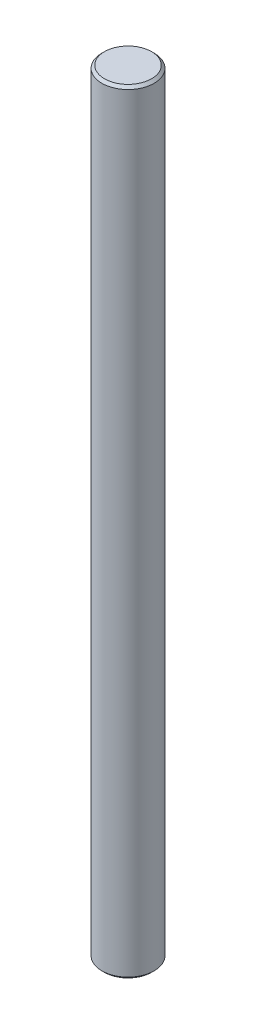
ISO-10303-21;
HEADER;
FILE_DESCRIPTION(('STEP AP214'),'2;1');
FILE_NAME('part.step','',(''),(''),'','','');
FILE_SCHEMA(('AUTOMOTIVE_DESIGN { 1 0 10303 214 1 1 1 1 }'));
ENDSEC;
DATA;
#1=APPLICATION_CONTEXT('core data for automotive mechanical design processes');
#2=APPLICATION_PROTOCOL_DEFINITION('international standard','automotive_design',2000,#1);
#3=PRODUCT_CONTEXT('',#1,'mechanical');
#4=PRODUCT('Part','Part','',(#3));
#5=PRODUCT_RELATED_PRODUCT_CATEGORY('part','',(#4));
#6=PRODUCT_DEFINITION_FORMATION('','',#4);
#7=PRODUCT_DEFINITION_CONTEXT('part definition',#1,'design');
#8=PRODUCT_DEFINITION('design','',#6,#7);
#9=PRODUCT_DEFINITION_SHAPE('','',#8);
#10=(LENGTH_UNIT() NAMED_UNIT(*) SI_UNIT(.MILLI.,.METRE.));
#11=(NAMED_UNIT(*) PLANE_ANGLE_UNIT() SI_UNIT($,.RADIAN.));
#12=(NAMED_UNIT(*) SI_UNIT($,.STERADIAN.) SOLID_ANGLE_UNIT());
#13=UNCERTAINTY_MEASURE_WITH_UNIT(LENGTH_MEASURE(1.E-05),#10,'distance_accuracy_value','');
#14=(GEOMETRIC_REPRESENTATION_CONTEXT(3) GLOBAL_UNCERTAINTY_ASSIGNED_CONTEXT((#13)) GLOBAL_UNIT_ASSIGNED_CONTEXT((#10,
#11,#12)) REPRESENTATION_CONTEXT('',''));
#15=CARTESIAN_POINT('',(0.,0.,0.));
#16=DIRECTION('',(0.,0.,1.));
#17=DIRECTION('',(1.,0.,0.));
#18=AXIS2_PLACEMENT_3D('',#15,#16,#17);
#19=CARTESIAN_POINT('',(0.,-74.,2.49999999999999));
#20=DIRECTION('',(0.,1.,0.));
#21=DIRECTION('',(0.,0.,1.));
#22=AXIS2_PLACEMENT_3D('',#19,#20,#21);
#23=PLANE('',#22);
#24=CARTESIAN_POINT('',(0.,-74.,0.));
#25=DIRECTION('',(0.,1.,0.));
#26=DIRECTION('',(0.,0.,1.));
#27=AXIS2_PLACEMENT_3D('',#24,#25,#26);
#28=CIRCLE('',#27,2.25);
#29=CARTESIAN_POINT('',(0.,-74.,2.24999999999999));
#30=VERTEX_POINT('',#29);
#31=EDGE_CURVE('E30',#30,#30,#28,.F.);
#32=ORIENTED_EDGE('',*,*,#31,.T.);
#33=EDGE_LOOP('',(#32));
#34=FACE_BOUND('',#33,.T.);
#35=ADVANCED_FACE('F15',(#34),#23,.F.);
#36=CARTESIAN_POINT('',(0.,-74.,0.));
#37=DIRECTION('',(0.,1.,0.));
#38=DIRECTION('',(0.,0.,1.));
#39=AXIS2_PLACEMENT_3D('',#36,#37,#38);
#40=CONICAL_SURFACE('',#39,2.25,0.785398163397448);
#41=CARTESIAN_POINT('',(0.,-73.75,0.));
#42=DIRECTION('',(0.,1.,0.));
#43=DIRECTION('',(0.,0.,1.));
#44=AXIS2_PLACEMENT_3D('',#41,#42,#43);
#45=CIRCLE('',#44,2.5);
#46=CARTESIAN_POINT('',(0.,-73.75,2.49999999999999));
#47=VERTEX_POINT('',#46);
#48=EDGE_CURVE('E26',#47,#47,#45,.T.);
#49=ORIENTED_EDGE('',*,*,#48,.F.);
#50=EDGE_LOOP('',(#49));
#51=FACE_BOUND('',#50,.T.);
#52=ORIENTED_EDGE('',*,*,#31,.F.);
#53=EDGE_LOOP('',(#52));
#54=FACE_BOUND('',#53,.T.);
#55=ADVANCED_FACE('F37',(#51,#54),#40,.T.);
#56=CARTESIAN_POINT('',(0.,0.,0.));
#57=DIRECTION('',(0.,-1.,0.));
#58=DIRECTION('',(0.,0.,-1.));
#59=AXIS2_PLACEMENT_3D('',#56,#57,#58);
#60=PLANE('',#59);
#61=CARTESIAN_POINT('',(0.,0.,0.));
#62=DIRECTION('',(0.,-1.,0.));
#63=DIRECTION('',(0.,0.,-1.));
#64=AXIS2_PLACEMENT_3D('',#61,#62,#63);
#65=CIRCLE('',#64,2.25);
#66=CARTESIAN_POINT('',(0.,0.,-2.25));
#67=VERTEX_POINT('',#66);
#68=EDGE_CURVE('E10',#67,#67,#65,.F.);
#69=ORIENTED_EDGE('',*,*,#68,.T.);
#70=EDGE_LOOP('',(#69));
#71=FACE_BOUND('',#70,.T.);
#72=ADVANCED_FACE('F39',(#71),#60,.F.);
#73=CARTESIAN_POINT('',(0.,-0.249999999999999,0.));
#74=DIRECTION('',(0.,-1.,0.));
#75=DIRECTION('',(0.,0.,-1.));
#76=AXIS2_PLACEMENT_3D('',#73,#74,#75);
#77=CONICAL_SURFACE('',#76,2.5,0.785398163397449);
#78=ORIENTED_EDGE('',*,*,#68,.F.);
#79=EDGE_LOOP('',(#78));
#80=FACE_BOUND('',#79,.T.);
#81=CARTESIAN_POINT('',(0.,-0.249999999999999,0.));
#82=DIRECTION('',(0.,-1.,0.));
#83=DIRECTION('',(0.,0.,-1.));
#84=AXIS2_PLACEMENT_3D('',#81,#82,#83);
#85=CIRCLE('',#84,2.5);
#86=CARTESIAN_POINT('',(0.,-0.249999999999999,-2.5));
#87=VERTEX_POINT('',#86);
#88=EDGE_CURVE('E22',#87,#87,#85,.T.);
#89=ORIENTED_EDGE('',*,*,#88,.F.);
#90=EDGE_LOOP('',(#89));
#91=FACE_BOUND('',#90,.T.);
#92=ADVANCED_FACE('F17',(#80,#91),#77,.T.);
#93=CARTESIAN_POINT('',(0.,4.4,0.));
#94=DIRECTION('',(0.,-1.,0.));
#95=DIRECTION('',(0.,0.,-1.));
#96=AXIS2_PLACEMENT_3D('',#93,#94,#95);
#97=CYLINDRICAL_SURFACE('',#96,2.5);
#98=ORIENTED_EDGE('',*,*,#88,.T.);
#99=EDGE_LOOP('',(#98));
#100=FACE_BOUND('',#99,.T.);
#101=ORIENTED_EDGE('',*,*,#48,.T.);
#102=EDGE_LOOP('',(#101));
#103=FACE_BOUND('',#102,.T.);
#104=ADVANCED_FACE('F50',(#100,#103),#97,.T.);
#105=CLOSED_SHELL('',(#35,#55,#72,#92,#104));
#106=MANIFOLD_SOLID_BREP('B1',#105);
#107=ADVANCED_BREP_SHAPE_REPRESENTATION('',(#18,#106),#14);
#108=SHAPE_DEFINITION_REPRESENTATION(#9,#107);
ENDSEC;
END-ISO-10303-21;
